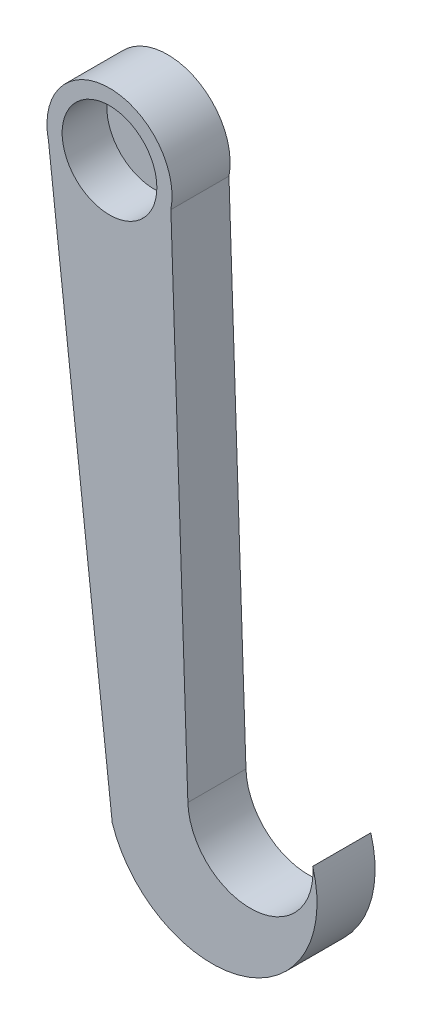
ISO-10303-21;
HEADER;
FILE_DESCRIPTION(('STEP AP214'),'2;1');
FILE_NAME('part.step','',(''),(''),'','','');
FILE_SCHEMA(('AUTOMOTIVE_DESIGN { 1 0 10303 214 1 1 1 1 }'));
ENDSEC;
DATA;
#1=APPLICATION_CONTEXT('core data for automotive mechanical design processes');
#2=APPLICATION_PROTOCOL_DEFINITION('international standard','automotive_design',2000,#1);
#3=PRODUCT_CONTEXT('',#1,'mechanical');
#4=PRODUCT('Part','Part','',(#3));
#5=PRODUCT_RELATED_PRODUCT_CATEGORY('part','',(#4));
#6=PRODUCT_DEFINITION_FORMATION('','',#4);
#7=PRODUCT_DEFINITION_CONTEXT('part definition',#1,'design');
#8=PRODUCT_DEFINITION('design','',#6,#7);
#9=PRODUCT_DEFINITION_SHAPE('','',#8);
#10=(LENGTH_UNIT() NAMED_UNIT(*) SI_UNIT(.MILLI.,.METRE.));
#11=(NAMED_UNIT(*) PLANE_ANGLE_UNIT() SI_UNIT($,.RADIAN.));
#12=(NAMED_UNIT(*) SI_UNIT($,.STERADIAN.) SOLID_ANGLE_UNIT());
#13=UNCERTAINTY_MEASURE_WITH_UNIT(LENGTH_MEASURE(1.E-05),#10,'distance_accuracy_value','');
#14=(GEOMETRIC_REPRESENTATION_CONTEXT(3) GLOBAL_UNCERTAINTY_ASSIGNED_CONTEXT((#13)) GLOBAL_UNIT_ASSIGNED_CONTEXT((#10,
#11,#12)) REPRESENTATION_CONTEXT('',''));
#15=CARTESIAN_POINT('',(0.,0.,0.));
#16=DIRECTION('',(0.,0.,1.));
#17=DIRECTION('',(1.,0.,0.));
#18=AXIS2_PLACEMENT_3D('',#15,#16,#17);
#19=CARTESIAN_POINT('',(0.,0.,13.));
#20=DIRECTION('',(0.,0.,-1.));
#21=DIRECTION('',(-1.,0.,0.));
#22=AXIS2_PLACEMENT_3D('',#19,#20,#21);
#23=CYLINDRICAL_SURFACE('',#22,14.);
#24=CARTESIAN_POINT('',(0.,0.,13.));
#25=DIRECTION('',(0.,0.,1.));
#26=DIRECTION('',(1.,0.,0.));
#27=AXIS2_PLACEMENT_3D('',#24,#25,#26);
#28=CIRCLE('',#27,14.);
#29=CARTESIAN_POINT('',(13.7355783574531,-2.70811506148946,13.));
#30=VERTEX_POINT('',#29);
#31=CARTESIAN_POINT('',(-13.6489972699894,-3.1152645993273,13.));
#32=VERTEX_POINT('',#31);
#33=EDGE_CURVE('E11',#30,#32,#28,.T.);
#34=ORIENTED_EDGE('',*,*,#33,.F.);
#35=DIRECTION('',(0.,0.,1.));
#36=VECTOR('',#35,1.);
#37=CARTESIAN_POINT('',(13.7355783574531,-2.70811506148946,0.));
#38=LINE('',#37,#36);
#39=CARTESIAN_POINT('',(13.7355783574531,-2.70811506148946,0.));
#40=VERTEX_POINT('',#39);
#41=EDGE_CURVE('E117',#40,#30,#38,.T.);
#42=ORIENTED_EDGE('',*,*,#41,.F.);
#43=CARTESIAN_POINT('',(0.,0.,0.));
#44=DIRECTION('',(0.,0.,1.));
#45=DIRECTION('',(1.,0.,0.));
#46=AXIS2_PLACEMENT_3D('',#43,#44,#45);
#47=CIRCLE('',#46,14.);
#48=CARTESIAN_POINT('',(-13.6489972699894,-3.1152645993273,0.));
#49=VERTEX_POINT('',#48);
#50=EDGE_CURVE('E36',#40,#49,#47,.T.);
#51=ORIENTED_EDGE('',*,*,#50,.T.);
#52=DIRECTION('',(0.,0.,1.));
#53=VECTOR('',#52,1.);
#54=CARTESIAN_POINT('',(-13.6489972699894,-3.11526459932734,0.));
#55=LINE('',#54,#53);
#56=EDGE_CURVE('E50',#49,#32,#55,.T.);
#57=ORIENTED_EDGE('',*,*,#56,.T.);
#58=EDGE_LOOP('',(#34,#42,#51,#57));
#59=FACE_BOUND('',#58,.T.);
#60=ADVANCED_FACE('F33',(#59),#23,.T.);
#61=CARTESIAN_POINT('',(0.,0.,13.));
#62=DIRECTION('',(0.,0.,1.));
#63=DIRECTION('',(1.,0.,0.));
#64=AXIS2_PLACEMENT_3D('',#61,#62,#63);
#65=PLANE('',#64);
#66=CARTESIAN_POINT('',(0.,0.,13.));
#67=DIRECTION('',(0.,0.,1.));
#68=DIRECTION('',(1.,0.,0.));
#69=AXIS2_PLACEMENT_3D('',#66,#67,#68);
#70=CIRCLE('',#69,10.6);
#71=CARTESIAN_POINT('',(10.6,0.,13.));
#72=VERTEX_POINT('',#71);
#73=EDGE_CURVE('E104',#72,#72,#70,.T.);
#74=ORIENTED_EDGE('',*,*,#73,.F.);
#75=EDGE_LOOP('',(#74));
#76=FACE_BOUND('',#75,.T.);
#77=ORIENTED_EDGE('',*,*,#33,.T.);
#78=DIRECTION('',(0.113325812197235,-0.99355787968786,0.));
#79=VECTOR('',#78,1.);
#80=CARTESIAN_POINT('',(-13.6489972699894,-3.11526459932734,13.));
#81=LINE('',#80,#79);
#82=CARTESIAN_POINT('',(0.60857827166369,-128.115264599327,13.));
#83=VERTEX_POINT('',#82);
#84=EDGE_CURVE('E111',#32,#83,#81,.T.);
#85=ORIENTED_EDGE('',*,*,#84,.T.);
#86=CARTESIAN_POINT('',(22.93337957418,-120.746013425787,13.));
#87=DIRECTION('',(0.,0.,1.));
#88=DIRECTION('',(1.,0.,0.));
#89=AXIS2_PLACEMENT_3D('',#86,#87,#88);
#90=CIRCLE('',#89,23.5096281564714);
#91=CARTESIAN_POINT('',(45.4860333922168,-114.106704589821,13.));
#92=VERTEX_POINT('',#91);
#93=EDGE_CURVE('E81',#83,#92,#90,.T.);
#94=ORIENTED_EDGE('',*,*,#93,.T.);
#95=CARTESIAN_POINT('',(31.5317417841716,-115.237078739225,13.));
#96=DIRECTION('',(0.,0.,-1.));
#97=DIRECTION('',(1.,0.,0.));
#98=AXIS2_PLACEMENT_3D('',#95,#96,#97);
#99=CIRCLE('',#98,14.);
#100=CARTESIAN_POINT('',(17.5396681428879,-115.708115061489,13.));
#101=VERTEX_POINT('',#100);
#102=EDGE_CURVE('E101',#92,#101,#99,.T.);
#103=ORIENTED_EDGE('',*,*,#102,.T.);
#104=DIRECTION('',(-0.0336454515903026,0.999433831520269,0.));
#105=VECTOR('',#104,1.);
#106=CARTESIAN_POINT('',(13.7355783574531,-2.70811506148946,13.));
#107=LINE('',#106,#105);
#108=EDGE_CURVE('E98',#101,#30,#107,.T.);
#109=ORIENTED_EDGE('',*,*,#108,.T.);
#110=EDGE_LOOP('',(#77,#85,#94,#103,#109));
#111=FACE_BOUND('',#110,.T.);
#112=ADVANCED_FACE('F127',(#76,#111),#65,.T.);
#113=CARTESIAN_POINT('',(0.,0.,0.));
#114=DIRECTION('',(0.,0.,1.));
#115=DIRECTION('',(1.,0.,0.));
#116=AXIS2_PLACEMENT_3D('',#113,#114,#115);
#117=PLANE('',#116);
#118=ORIENTED_EDGE('',*,*,#50,.F.);
#119=DIRECTION('',(-0.0336454515903026,0.999433831520269,0.));
#120=VECTOR('',#119,1.);
#121=CARTESIAN_POINT('',(13.7355783574531,-2.70811506148946,0.));
#122=LINE('',#121,#120);
#123=CARTESIAN_POINT('',(17.5396681428879,-115.708115061489,0.));
#124=VERTEX_POINT('',#123);
#125=EDGE_CURVE('E108',#124,#40,#122,.T.);
#126=ORIENTED_EDGE('',*,*,#125,.F.);
#127=CARTESIAN_POINT('',(31.5317417841716,-115.237078739225,0.));
#128=DIRECTION('',(0.,0.,-1.));
#129=DIRECTION('',(1.,0.,0.));
#130=AXIS2_PLACEMENT_3D('',#127,#128,#129);
#131=CIRCLE('',#130,14.);
#132=CARTESIAN_POINT('',(45.4860333922168,-114.106704589821,0.));
#133=VERTEX_POINT('',#132);
#134=EDGE_CURVE('E95',#133,#124,#131,.T.);
#135=ORIENTED_EDGE('',*,*,#134,.F.);
#136=CARTESIAN_POINT('',(22.93337957418,-120.746013425787,0.));
#137=DIRECTION('',(0.,0.,1.));
#138=DIRECTION('',(1.,0.,0.));
#139=AXIS2_PLACEMENT_3D('',#136,#137,#138);
#140=CIRCLE('',#139,23.5096281564714);
#141=CARTESIAN_POINT('',(0.60857827166369,-128.115264599327,0.));
#142=VERTEX_POINT('',#141);
#143=EDGE_CURVE('E79',#142,#133,#140,.T.);
#144=ORIENTED_EDGE('',*,*,#143,.F.);
#145=DIRECTION('',(0.113325812197235,-0.99355787968786,0.));
#146=VECTOR('',#145,1.);
#147=CARTESIAN_POINT('',(-13.6489972699894,-3.11526459932734,0.));
#148=LINE('',#147,#146);
#149=EDGE_CURVE('E92',#49,#142,#148,.T.);
#150=ORIENTED_EDGE('',*,*,#149,.F.);
#151=EDGE_LOOP('',(#118,#126,#135,#144,#150));
#152=FACE_BOUND('',#151,.T.);
#153=ADVANCED_FACE('F91',(#152),#117,.F.);
#154=CARTESIAN_POINT('',(13.7355783574531,-2.70811506148946,0.));
#155=DIRECTION('',(0.999433831520269,0.0336454515903026,0.));
#156=DIRECTION('',(-0.0336454515903026,0.999433831520269,0.));
#157=AXIS2_PLACEMENT_3D('',#154,#155,#156);
#158=PLANE('',#157);
#159=ORIENTED_EDGE('',*,*,#108,.F.);
#160=DIRECTION('',(0.,0.,1.));
#161=VECTOR('',#160,1.);
#162=CARTESIAN_POINT('',(17.5396681428879,-115.708115061489,0.));
#163=LINE('',#162,#161);
#164=EDGE_CURVE('E119',#124,#101,#163,.T.);
#165=ORIENTED_EDGE('',*,*,#164,.F.);
#166=ORIENTED_EDGE('',*,*,#125,.T.);
#167=ORIENTED_EDGE('',*,*,#41,.T.);
#168=EDGE_LOOP('',(#159,#165,#166,#167));
#169=FACE_BOUND('',#168,.T.);
#170=ADVANCED_FACE('F129',(#169),#158,.T.);
#171=CARTESIAN_POINT('',(31.5317417841716,-115.237078739225,0.));
#172=DIRECTION('',(0.,0.,1.));
#173=DIRECTION('',(1.,0.,0.));
#174=AXIS2_PLACEMENT_3D('',#171,#172,#173);
#175=CYLINDRICAL_SURFACE('',#174,14.);
#176=ORIENTED_EDGE('',*,*,#102,.F.);
#177=DIRECTION('',(0.,0.,1.));
#178=VECTOR('',#177,1.);
#179=CARTESIAN_POINT('',(45.4860333922168,-114.106704589821,0.));
#180=LINE('',#179,#178);
#181=EDGE_CURVE('E86',#133,#92,#180,.T.);
#182=ORIENTED_EDGE('',*,*,#181,.F.);
#183=ORIENTED_EDGE('',*,*,#134,.T.);
#184=ORIENTED_EDGE('',*,*,#164,.T.);
#185=EDGE_LOOP('',(#176,#182,#183,#184));
#186=FACE_BOUND('',#185,.T.);
#187=ADVANCED_FACE('F124',(#186),#175,.F.);
#188=CARTESIAN_POINT('',(22.93337957418,-120.746013425787,0.));
#189=DIRECTION('',(0.,0.,1.));
#190=DIRECTION('',(1.,0.,0.));
#191=AXIS2_PLACEMENT_3D('',#188,#189,#190);
#192=CYLINDRICAL_SURFACE('',#191,23.5096281564714);
#193=ORIENTED_EDGE('',*,*,#93,.F.);
#194=DIRECTION('',(0.,0.,1.));
#195=VECTOR('',#194,1.);
#196=CARTESIAN_POINT('',(0.60857827166369,-128.115264599327,0.));
#197=LINE('',#196,#195);
#198=EDGE_CURVE('E76',#142,#83,#197,.T.);
#199=ORIENTED_EDGE('',*,*,#198,.F.);
#200=ORIENTED_EDGE('',*,*,#143,.T.);
#201=ORIENTED_EDGE('',*,*,#181,.T.);
#202=EDGE_LOOP('',(#193,#199,#200,#201));
#203=FACE_BOUND('',#202,.T.);
#204=ADVANCED_FACE('F78',(#203),#192,.T.);
#205=CARTESIAN_POINT('',(-13.6489972699894,-3.11526459932734,0.));
#206=DIRECTION('',(-0.99355787968786,-0.113325812197235,0.));
#207=DIRECTION('',(0.113325812197235,-0.993557879687861,0.));
#208=AXIS2_PLACEMENT_3D('',#205,#206,#207);
#209=PLANE('',#208);
#210=ORIENTED_EDGE('',*,*,#84,.F.);
#211=ORIENTED_EDGE('',*,*,#56,.F.);
#212=ORIENTED_EDGE('',*,*,#149,.T.);
#213=ORIENTED_EDGE('',*,*,#198,.T.);
#214=EDGE_LOOP('',(#210,#211,#212,#213));
#215=FACE_BOUND('',#214,.T.);
#216=ADVANCED_FACE('F97',(#215),#209,.T.);
#217=CARTESIAN_POINT('',(0.,0.,3.));
#218=DIRECTION('',(0.,0.,1.));
#219=DIRECTION('',(1.,0.,0.));
#220=AXIS2_PLACEMENT_3D('',#217,#218,#219);
#221=CYLINDRICAL_SURFACE('',#220,10.6);
#222=CARTESIAN_POINT('',(0.,0.,3.));
#223=DIRECTION('',(0.,0.,1.));
#224=DIRECTION('',(1.,0.,0.));
#225=AXIS2_PLACEMENT_3D('',#222,#223,#224);
#226=CIRCLE('',#225,10.6);
#227=CARTESIAN_POINT('',(10.6,0.,3.));
#228=VERTEX_POINT('',#227);
#229=EDGE_CURVE('E113',#228,#228,#226,.T.);
#230=ORIENTED_EDGE('',*,*,#229,.F.);
#231=EDGE_LOOP('',(#230));
#232=FACE_BOUND('',#231,.T.);
#233=ORIENTED_EDGE('',*,*,#73,.T.);
#234=EDGE_LOOP('',(#233));
#235=FACE_BOUND('',#234,.T.);
#236=ADVANCED_FACE('F144',(#232,#235),#221,.F.);
#237=CARTESIAN_POINT('',(0.,0.,3.));
#238=DIRECTION('',(0.,0.,1.));
#239=DIRECTION('',(1.,0.,0.));
#240=AXIS2_PLACEMENT_3D('',#237,#238,#239);
#241=PLANE('',#240);
#242=ORIENTED_EDGE('',*,*,#229,.T.);
#243=EDGE_LOOP('',(#242));
#244=FACE_BOUND('',#243,.T.);
#245=ADVANCED_FACE('F141',(#244),#241,.T.);
#246=CLOSED_SHELL('',(#60,#112,#153,#170,#187,#204,#216,#236,#245));
#247=MANIFOLD_SOLID_BREP('B2',#246);
#248=ADVANCED_BREP_SHAPE_REPRESENTATION('',(#18,#247),#14);
#249=SHAPE_DEFINITION_REPRESENTATION(#9,#248);
ENDSEC;
END-ISO-10303-21;
